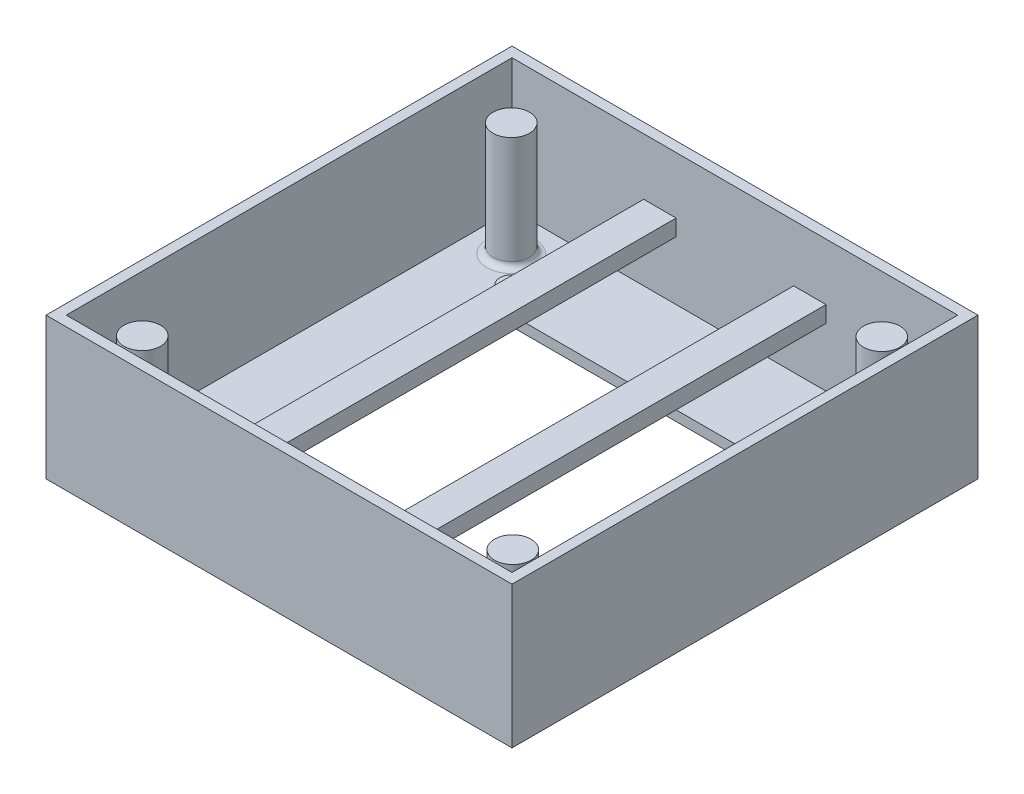
ISO-10303-21;
HEADER;
FILE_DESCRIPTION(('STEP AP214'),'2;1');
FILE_NAME('part.step','',(''),(''),'','','');
FILE_SCHEMA(('AUTOMOTIVE_DESIGN { 1 0 10303 214 1 1 1 1 }'));
ENDSEC;
DATA;
#1=APPLICATION_CONTEXT('core data for automotive mechanical design processes');
#2=APPLICATION_PROTOCOL_DEFINITION('international standard','automotive_design',2000,#1);
#3=PRODUCT_CONTEXT('',#1,'mechanical');
#4=PRODUCT('Part','Part','',(#3));
#5=PRODUCT_RELATED_PRODUCT_CATEGORY('part','',(#4));
#6=PRODUCT_DEFINITION_FORMATION('','',#4);
#7=PRODUCT_DEFINITION_CONTEXT('part definition',#1,'design');
#8=PRODUCT_DEFINITION('design','',#6,#7);
#9=PRODUCT_DEFINITION_SHAPE('','',#8);
#10=(LENGTH_UNIT() NAMED_UNIT(*) SI_UNIT(.MILLI.,.METRE.));
#11=(NAMED_UNIT(*) PLANE_ANGLE_UNIT() SI_UNIT($,.RADIAN.));
#12=(NAMED_UNIT(*) SI_UNIT($,.STERADIAN.) SOLID_ANGLE_UNIT());
#13=UNCERTAINTY_MEASURE_WITH_UNIT(LENGTH_MEASURE(1.E-05),#10,'distance_accuracy_value','');
#14=(GEOMETRIC_REPRESENTATION_CONTEXT(3) GLOBAL_UNCERTAINTY_ASSIGNED_CONTEXT((#13)) GLOBAL_UNIT_ASSIGNED_CONTEXT((#10,
#11,#12)) REPRESENTATION_CONTEXT('',''));
#15=CARTESIAN_POINT('',(0.,0.,0.));
#16=DIRECTION('',(0.,0.,1.));
#17=DIRECTION('',(1.,0.,0.));
#18=AXIS2_PLACEMENT_3D('',#15,#16,#17);
#19=CARTESIAN_POINT('',(-57.4999999999998,35.,-55.0000000000001));
#20=DIRECTION('',(0.,0.,1.));
#21=DIRECTION('',(1.,0.,0.));
#22=AXIS2_PLACEMENT_3D('',#19,#20,#21);
#23=PLANE('',#22);
#24=DIRECTION('',(-1.,0.,0.));
#25=VECTOR('',#24,1.);
#26=CARTESIAN_POINT('',(-57.4999999999998,21.,-55.0000000000001));
#27=LINE('',#26,#25);
#28=CARTESIAN_POINT('',(22.5,21.,-55.0000000000001));
#29=VERTEX_POINT('',#28);
#30=CARTESIAN_POINT('',(14.5,21.,-55.0000000000001));
#31=VERTEX_POINT('',#30);
#32=EDGE_CURVE('E192',#29,#31,#27,.T.);
#33=ORIENTED_EDGE('',*,*,#32,.F.);
#34=DIRECTION('',(0.,-1.,0.));
#35=VECTOR('',#34,1.);
#36=CARTESIAN_POINT('',(22.5,35.,-55.0000000000001));
#37=LINE('',#36,#35);
#38=CARTESIAN_POINT('',(22.5,17.,-55.0000000000001));
#39=VERTEX_POINT('',#38);
#40=EDGE_CURVE('E198',#29,#39,#37,.T.);
#41=ORIENTED_EDGE('',*,*,#40,.T.);
#42=DIRECTION('',(-1.,0.,0.));
#43=VECTOR('',#42,1.);
#44=CARTESIAN_POINT('',(-57.4999999999998,17.,-55.0000000000001));
#45=LINE('',#44,#43);
#46=CARTESIAN_POINT('',(14.5,17.,-55.0000000000001));
#47=VERTEX_POINT('',#46);
#48=EDGE_CURVE('E180',#39,#47,#45,.T.);
#49=ORIENTED_EDGE('',*,*,#48,.T.);
#50=DIRECTION('',(0.,1.,0.));
#51=VECTOR('',#50,1.);
#52=CARTESIAN_POINT('',(14.5,35.,-55.0000000000001));
#53=LINE('',#52,#51);
#54=EDGE_CURVE('E210',#47,#31,#53,.T.);
#55=ORIENTED_EDGE('',*,*,#54,.T.);
#56=EDGE_LOOP('',(#33,#41,#49,#55));
#57=FACE_BOUND('',#56,.T.);
#58=DIRECTION('',(-1.,0.,0.));
#59=VECTOR('',#58,1.);
#60=CARTESIAN_POINT('',(-57.4999999999998,2.5,-55.0000000000001));
#61=LINE('',#60,#59);
#62=CARTESIAN_POINT('',(55.0000000000002,2.5,-55.0000000000001));
#63=VERTEX_POINT('',#62);
#64=CARTESIAN_POINT('',(-54.9999999999998,2.5,-55.0000000000001));
#65=VERTEX_POINT('',#64);
#66=EDGE_CURVE('E274',#63,#65,#61,.T.);
#67=ORIENTED_EDGE('',*,*,#66,.F.);
#68=DIRECTION('',(0.,-1.,0.));
#69=VECTOR('',#68,1.);
#70=CARTESIAN_POINT('',(55.0000000000002,35.,-55.0000000000001));
#71=LINE('',#70,#69);
#72=CARTESIAN_POINT('',(55.0000000000002,35.,-55.0000000000001));
#73=VERTEX_POINT('',#72);
#74=EDGE_CURVE('E275',#73,#63,#71,.T.);
#75=ORIENTED_EDGE('',*,*,#74,.F.);
#76=DIRECTION('',(-1.,0.,0.));
#77=VECTOR('',#76,1.);
#78=CARTESIAN_POINT('',(-57.4999999999998,35.,-55.0000000000001));
#79=LINE('',#78,#77);
#80=CARTESIAN_POINT('',(-54.9999999999998,35.,-55.0000000000001));
#81=VERTEX_POINT('',#80);
#82=EDGE_CURVE('E304',#73,#81,#79,.T.);
#83=ORIENTED_EDGE('',*,*,#82,.T.);
#84=DIRECTION('',(0.,-1.,0.));
#85=VECTOR('',#84,1.);
#86=CARTESIAN_POINT('',(-54.9999999999998,35.,-55.0000000000001));
#87=LINE('',#86,#85);
#88=EDGE_CURVE('E280',#81,#65,#87,.T.);
#89=ORIENTED_EDGE('',*,*,#88,.T.);
#90=EDGE_LOOP('',(#67,#75,#83,#89));
#91=FACE_BOUND('',#90,.T.);
#92=DIRECTION('',(0.,1.,0.));
#93=VECTOR('',#92,1.);
#94=CARTESIAN_POINT('',(-22.5,35.,-55.0000000000001));
#95=LINE('',#94,#93);
#96=CARTESIAN_POINT('',(-22.5,17.,-55.0000000000001));
#97=VERTEX_POINT('',#96);
#98=CARTESIAN_POINT('',(-22.5,21.,-55.0000000000001));
#99=VERTEX_POINT('',#98);
#100=EDGE_CURVE('E61',#97,#99,#95,.T.);
#101=ORIENTED_EDGE('',*,*,#100,.T.);
#102=DIRECTION('',(1.,0.,0.));
#103=VECTOR('',#102,1.);
#104=CARTESIAN_POINT('',(-57.4999999999998,21.,-55.0000000000001));
#105=LINE('',#104,#103);
#106=CARTESIAN_POINT('',(-14.5,21.,-55.0000000000001));
#107=VERTEX_POINT('',#106);
#108=EDGE_CURVE('E65',#99,#107,#105,.T.);
#109=ORIENTED_EDGE('',*,*,#108,.T.);
#110=DIRECTION('',(0.,-1.,0.));
#111=VECTOR('',#110,1.);
#112=CARTESIAN_POINT('',(-14.5,35.,-55.0000000000001));
#113=LINE('',#112,#111);
#114=CARTESIAN_POINT('',(-14.5,17.,-55.0000000000001));
#115=VERTEX_POINT('',#114);
#116=EDGE_CURVE('E221',#107,#115,#113,.T.);
#117=ORIENTED_EDGE('',*,*,#116,.T.);
#118=DIRECTION('',(1.,0.,0.));
#119=VECTOR('',#118,1.);
#120=CARTESIAN_POINT('',(-57.4999999999998,17.,-55.0000000000001));
#121=LINE('',#120,#119);
#122=EDGE_CURVE('E209',#97,#115,#121,.T.);
#123=ORIENTED_EDGE('',*,*,#122,.F.);
#124=EDGE_LOOP('',(#101,#109,#117,#123));
#125=FACE_BOUND('',#124,.T.);
#126=ADVANCED_FACE('F45',(#57,#91,#125),#23,.T.);
#127=CARTESIAN_POINT('',(-57.4999999999998,35.,54.9999999999997));
#128=DIRECTION('',(0.,0.,-1.));
#129=DIRECTION('',(-1.,0.,0.));
#130=AXIS2_PLACEMENT_3D('',#127,#128,#129);
#131=PLANE('',#130);
#132=DIRECTION('',(1.,0.,0.));
#133=VECTOR('',#132,1.);
#134=CARTESIAN_POINT('',(-57.4999999999998,21.,54.9999999999997));
#135=LINE('',#134,#133);
#136=CARTESIAN_POINT('',(14.5,21.,54.9999999999997));
#137=VERTEX_POINT('',#136);
#138=CARTESIAN_POINT('',(22.5,21.,54.9999999999997));
#139=VERTEX_POINT('',#138);
#140=EDGE_CURVE('E408',#137,#139,#135,.T.);
#141=ORIENTED_EDGE('',*,*,#140,.F.);
#142=DIRECTION('',(0.,-1.,0.));
#143=VECTOR('',#142,1.);
#144=CARTESIAN_POINT('',(14.5,35.,54.9999999999997));
#145=LINE('',#144,#143);
#146=CARTESIAN_POINT('',(14.5,17.,54.9999999999997));
#147=VERTEX_POINT('',#146);
#148=EDGE_CURVE('E402',#137,#147,#145,.T.);
#149=ORIENTED_EDGE('',*,*,#148,.T.);
#150=DIRECTION('',(1.,0.,0.));
#151=VECTOR('',#150,1.);
#152=CARTESIAN_POINT('',(-57.4999999999998,17.,54.9999999999997));
#153=LINE('',#152,#151);
#154=CARTESIAN_POINT('',(22.5,17.,54.9999999999997));
#155=VERTEX_POINT('',#154);
#156=EDGE_CURVE('E399',#147,#155,#153,.T.);
#157=ORIENTED_EDGE('',*,*,#156,.T.);
#158=DIRECTION('',(0.,1.,0.));
#159=VECTOR('',#158,1.);
#160=CARTESIAN_POINT('',(22.5,35.,54.9999999999997));
#161=LINE('',#160,#159);
#162=EDGE_CURVE('E201',#155,#139,#161,.T.);
#163=ORIENTED_EDGE('',*,*,#162,.T.);
#164=EDGE_LOOP('',(#141,#149,#157,#163));
#165=FACE_BOUND('',#164,.T.);
#166=DIRECTION('',(1.,0.,0.));
#167=VECTOR('',#166,1.);
#168=CARTESIAN_POINT('',(-57.4999999999998,2.5,54.9999999999997));
#169=LINE('',#168,#167);
#170=CARTESIAN_POINT('',(-54.9999999999998,2.5,54.9999999999997));
#171=VERTEX_POINT('',#170);
#172=CARTESIAN_POINT('',(55.0000000000002,2.5,54.9999999999997));
#173=VERTEX_POINT('',#172);
#174=EDGE_CURVE('E295',#171,#173,#169,.T.);
#175=ORIENTED_EDGE('',*,*,#174,.F.);
#176=DIRECTION('',(0.,-1.,0.));
#177=VECTOR('',#176,1.);
#178=CARTESIAN_POINT('',(-54.9999999999998,35.,54.9999999999997));
#179=LINE('',#178,#177);
#180=CARTESIAN_POINT('',(-54.9999999999998,35.,54.9999999999997));
#181=VERTEX_POINT('',#180);
#182=EDGE_CURVE('E285',#181,#171,#179,.T.);
#183=ORIENTED_EDGE('',*,*,#182,.F.);
#184=DIRECTION('',(1.,0.,0.));
#185=VECTOR('',#184,1.);
#186=CARTESIAN_POINT('',(-57.4999999999998,35.,54.9999999999997));
#187=LINE('',#186,#185);
#188=CARTESIAN_POINT('',(55.0000000000002,35.,54.9999999999997));
#189=VERTEX_POINT('',#188);
#190=EDGE_CURVE('E286',#181,#189,#187,.T.);
#191=ORIENTED_EDGE('',*,*,#190,.T.);
#192=DIRECTION('',(0.,-1.,0.));
#193=VECTOR('',#192,1.);
#194=CARTESIAN_POINT('',(55.0000000000002,35.,54.9999999999997));
#195=LINE('',#194,#193);
#196=EDGE_CURVE('E281',#189,#173,#195,.T.);
#197=ORIENTED_EDGE('',*,*,#196,.T.);
#198=EDGE_LOOP('',(#175,#183,#191,#197));
#199=FACE_BOUND('',#198,.T.);
#200=DIRECTION('',(0.,1.,0.));
#201=VECTOR('',#200,1.);
#202=CARTESIAN_POINT('',(-14.5,35.,54.9999999999997));
#203=LINE('',#202,#201);
#204=CARTESIAN_POINT('',(-14.5,17.,54.9999999999997));
#205=VERTEX_POINT('',#204);
#206=CARTESIAN_POINT('',(-14.5,21.,54.9999999999997));
#207=VERTEX_POINT('',#206);
#208=EDGE_CURVE('E415',#205,#207,#203,.T.);
#209=ORIENTED_EDGE('',*,*,#208,.T.);
#210=DIRECTION('',(-1.,0.,0.));
#211=VECTOR('',#210,1.);
#212=CARTESIAN_POINT('',(-57.4999999999998,21.,54.9999999999997));
#213=LINE('',#212,#211);
#214=CARTESIAN_POINT('',(-22.5,21.,54.9999999999997));
#215=VERTEX_POINT('',#214);
#216=EDGE_CURVE('E421',#207,#215,#213,.T.);
#217=ORIENTED_EDGE('',*,*,#216,.T.);
#218=DIRECTION('',(0.,-1.,0.));
#219=VECTOR('',#218,1.);
#220=CARTESIAN_POINT('',(-22.5,35.,54.9999999999997));
#221=LINE('',#220,#219);
#222=CARTESIAN_POINT('',(-22.5,17.,54.9999999999997));
#223=VERTEX_POINT('',#222);
#224=EDGE_CURVE('E418',#215,#223,#221,.T.);
#225=ORIENTED_EDGE('',*,*,#224,.T.);
#226=DIRECTION('',(-1.,0.,0.));
#227=VECTOR('',#226,1.);
#228=CARTESIAN_POINT('',(-57.4999999999998,17.,54.9999999999997));
#229=LINE('',#228,#227);
#230=EDGE_CURVE('E411',#205,#223,#229,.T.);
#231=ORIENTED_EDGE('',*,*,#230,.F.);
#232=EDGE_LOOP('',(#209,#217,#225,#231));
#233=FACE_BOUND('',#232,.T.);
#234=ADVANCED_FACE('F478',(#165,#199,#233),#131,.T.);
#235=CARTESIAN_POINT('',(57.5000000000002,35.,-57.5000000000001));
#236=DIRECTION('',(-1.,0.,0.));
#237=DIRECTION('',(0.,0.,1.));
#238=AXIS2_PLACEMENT_3D('',#235,#236,#237);
#239=PLANE('',#238);
#240=DIRECTION('',(0.,0.,-1.));
#241=VECTOR('',#240,1.);
#242=CARTESIAN_POINT('',(57.5000000000002,0.,-57.5000000000001));
#243=LINE('',#242,#241);
#244=CARTESIAN_POINT('',(57.5000000000002,0.,57.4999999999997));
#245=VERTEX_POINT('',#244);
#246=CARTESIAN_POINT('',(57.5000000000002,0.,-57.5000000000001));
#247=VERTEX_POINT('',#246);
#248=EDGE_CURVE('E279',#245,#247,#243,.T.);
#249=ORIENTED_EDGE('',*,*,#248,.T.);
#250=DIRECTION('',(0.,-1.,0.));
#251=VECTOR('',#250,1.);
#252=CARTESIAN_POINT('',(57.5000000000002,35.,-57.5000000000001));
#253=LINE('',#252,#251);
#254=CARTESIAN_POINT('',(57.5000000000002,35.,-57.5000000000001));
#255=VERTEX_POINT('',#254);
#256=EDGE_CURVE('E350',#255,#247,#253,.T.);
#257=ORIENTED_EDGE('',*,*,#256,.F.);
#258=DIRECTION('',(0.,0.,-1.));
#259=VECTOR('',#258,1.);
#260=CARTESIAN_POINT('',(57.5000000000002,35.,-57.5000000000001));
#261=LINE('',#260,#259);
#262=CARTESIAN_POINT('',(57.5000000000002,35.,57.4999999999997));
#263=VERTEX_POINT('',#262);
#264=EDGE_CURVE('E313',#263,#255,#261,.T.);
#265=ORIENTED_EDGE('',*,*,#264,.F.);
#266=DIRECTION('',(0.,-1.,0.));
#267=VECTOR('',#266,1.);
#268=CARTESIAN_POINT('',(57.5000000000002,35.,57.4999999999997));
#269=LINE('',#268,#267);
#270=EDGE_CURVE('E327',#263,#245,#269,.T.);
#271=ORIENTED_EDGE('',*,*,#270,.T.);
#272=EDGE_LOOP('',(#249,#257,#265,#271));
#273=FACE_BOUND('',#272,.T.);
#274=ADVANCED_FACE('F481',(#273),#239,.F.);
#275=CARTESIAN_POINT('',(-57.4999999999998,35.,-57.5000000000001));
#276=DIRECTION('',(0.,0.,1.));
#277=DIRECTION('',(1.,0.,0.));
#278=AXIS2_PLACEMENT_3D('',#275,#276,#277);
#279=PLANE('',#278);
#280=DIRECTION('',(-1.,0.,0.));
#281=VECTOR('',#280,1.);
#282=CARTESIAN_POINT('',(-57.4999999999998,0.,-57.5000000000001));
#283=LINE('',#282,#281);
#284=CARTESIAN_POINT('',(-57.4999999999998,0.,-57.5000000000001));
#285=VERTEX_POINT('',#284);
#286=EDGE_CURVE('E331',#247,#285,#283,.T.);
#287=ORIENTED_EDGE('',*,*,#286,.T.);
#288=DIRECTION('',(0.,-1.,0.));
#289=VECTOR('',#288,1.);
#290=CARTESIAN_POINT('',(-57.4999999999998,35.,-57.5000000000001));
#291=LINE('',#290,#289);
#292=CARTESIAN_POINT('',(-57.4999999999998,35.,-57.5000000000001));
#293=VERTEX_POINT('',#292);
#294=EDGE_CURVE('E346',#293,#285,#291,.T.);
#295=ORIENTED_EDGE('',*,*,#294,.F.);
#296=DIRECTION('',(-1.,0.,0.));
#297=VECTOR('',#296,1.);
#298=CARTESIAN_POINT('',(-57.4999999999998,35.,-57.5000000000001));
#299=LINE('',#298,#297);
#300=EDGE_CURVE('E317',#255,#293,#299,.T.);
#301=ORIENTED_EDGE('',*,*,#300,.F.);
#302=ORIENTED_EDGE('',*,*,#256,.T.);
#303=EDGE_LOOP('',(#287,#295,#301,#302));
#304=FACE_BOUND('',#303,.T.);
#305=ADVANCED_FACE('F559',(#304),#279,.F.);
#306=CARTESIAN_POINT('',(-57.4999999999998,35.,-57.5000000000001));
#307=DIRECTION('',(1.,0.,0.));
#308=DIRECTION('',(0.,0.,-1.));
#309=AXIS2_PLACEMENT_3D('',#306,#307,#308);
#310=PLANE('',#309);
#311=DIRECTION('',(0.,0.,1.));
#312=VECTOR('',#311,1.);
#313=CARTESIAN_POINT('',(-57.4999999999998,0.,-57.5000000000001));
#314=LINE('',#313,#312);
#315=CARTESIAN_POINT('',(-57.4999999999998,0.,57.4999999999997));
#316=VERTEX_POINT('',#315);
#317=EDGE_CURVE('E334',#285,#316,#314,.T.);
#318=ORIENTED_EDGE('',*,*,#317,.T.);
#319=DIRECTION('',(0.,-1.,0.));
#320=VECTOR('',#319,1.);
#321=CARTESIAN_POINT('',(-57.4999999999998,35.,57.4999999999997));
#322=LINE('',#321,#320);
#323=CARTESIAN_POINT('',(-57.4999999999998,35.,57.4999999999997));
#324=VERTEX_POINT('',#323);
#325=EDGE_CURVE('E342',#324,#316,#322,.T.);
#326=ORIENTED_EDGE('',*,*,#325,.F.);
#327=DIRECTION('',(0.,0.,1.));
#328=VECTOR('',#327,1.);
#329=CARTESIAN_POINT('',(-57.4999999999998,35.,-57.5000000000001));
#330=LINE('',#329,#328);
#331=EDGE_CURVE('E321',#293,#324,#330,.T.);
#332=ORIENTED_EDGE('',*,*,#331,.F.);
#333=ORIENTED_EDGE('',*,*,#294,.T.);
#334=EDGE_LOOP('',(#318,#326,#332,#333));
#335=FACE_BOUND('',#334,.T.);
#336=ADVANCED_FACE('F555',(#335),#310,.F.);
#337=CARTESIAN_POINT('',(-57.4999999999998,35.,57.4999999999997));
#338=DIRECTION('',(0.,0.,-1.));
#339=DIRECTION('',(-1.,0.,0.));
#340=AXIS2_PLACEMENT_3D('',#337,#338,#339);
#341=PLANE('',#340);
#342=DIRECTION('',(1.,0.,0.));
#343=VECTOR('',#342,1.);
#344=CARTESIAN_POINT('',(-57.4999999999998,0.,57.4999999999997));
#345=LINE('',#344,#343);
#346=EDGE_CURVE('E318',#316,#245,#345,.T.);
#347=ORIENTED_EDGE('',*,*,#346,.T.);
#348=ORIENTED_EDGE('',*,*,#270,.F.);
#349=DIRECTION('',(1.,0.,0.));
#350=VECTOR('',#349,1.);
#351=CARTESIAN_POINT('',(-57.4999999999998,35.,57.4999999999997));
#352=LINE('',#351,#350);
#353=EDGE_CURVE('E324',#324,#263,#352,.T.);
#354=ORIENTED_EDGE('',*,*,#353,.F.);
#355=ORIENTED_EDGE('',*,*,#325,.T.);
#356=EDGE_LOOP('',(#347,#348,#354,#355));
#357=FACE_BOUND('',#356,.T.);
#358=ADVANCED_FACE('F549',(#357),#341,.F.);
#359=CARTESIAN_POINT('',(0.,35.,0.));
#360=DIRECTION('',(0.,1.,0.));
#361=DIRECTION('',(0.,0.,1.));
#362=AXIS2_PLACEMENT_3D('',#359,#360,#361);
#363=PLANE('',#362);
#364=DIRECTION('',(0.,0.,-1.));
#365=VECTOR('',#364,1.);
#366=CARTESIAN_POINT('',(55.0000000000002,35.,-57.5000000000001));
#367=LINE('',#366,#365);
#368=EDGE_CURVE('E301',#189,#73,#367,.T.);
#369=ORIENTED_EDGE('',*,*,#368,.F.);
#370=ORIENTED_EDGE('',*,*,#190,.F.);
#371=DIRECTION('',(0.,0.,1.));
#372=VECTOR('',#371,1.);
#373=CARTESIAN_POINT('',(-54.9999999999998,35.,-57.5000000000001));
#374=LINE('',#373,#372);
#375=EDGE_CURVE('E307',#81,#181,#374,.T.);
#376=ORIENTED_EDGE('',*,*,#375,.F.);
#377=ORIENTED_EDGE('',*,*,#82,.F.);
#378=EDGE_LOOP('',(#369,#370,#376,#377));
#379=FACE_BOUND('',#378,.T.);
#380=ORIENTED_EDGE('',*,*,#264,.T.);
#381=ORIENTED_EDGE('',*,*,#300,.T.);
#382=ORIENTED_EDGE('',*,*,#331,.T.);
#383=ORIENTED_EDGE('',*,*,#353,.T.);
#384=EDGE_LOOP('',(#380,#381,#382,#383));
#385=FACE_BOUND('',#384,.T.);
#386=ADVANCED_FACE('F472',(#379,#385),#363,.T.);
#387=CARTESIAN_POINT('',(0.,0.,0.));
#388=DIRECTION('',(0.,1.,0.));
#389=DIRECTION('',(0.,0.,1.));
#390=AXIS2_PLACEMENT_3D('',#387,#388,#389);
#391=PLANE('',#390);
#392=DIRECTION('',(1.,0.,0.));
#393=VECTOR('',#392,1.);
#394=CARTESIAN_POINT('',(32.5,0.,-32.5));
#395=LINE('',#394,#393);
#396=CARTESIAN_POINT('',(-32.5,0.,-32.5));
#397=VERTEX_POINT('',#396);
#398=CARTESIAN_POINT('',(32.5,0.,-32.5));
#399=VERTEX_POINT('',#398);
#400=EDGE_CURVE('E229',#397,#399,#395,.T.);
#401=ORIENTED_EDGE('',*,*,#400,.F.);
#402=DIRECTION('',(0.,0.,-1.));
#403=VECTOR('',#402,1.);
#404=CARTESIAN_POINT('',(-32.5,0.,-32.5));
#405=LINE('',#404,#403);
#406=CARTESIAN_POINT('',(-32.5,0.,32.5));
#407=VERTEX_POINT('',#406);
#408=EDGE_CURVE('E226',#407,#397,#405,.T.);
#409=ORIENTED_EDGE('',*,*,#408,.F.);
#410=DIRECTION('',(-1.,0.,0.));
#411=VECTOR('',#410,1.);
#412=CARTESIAN_POINT('',(32.5,0.,32.5));
#413=LINE('',#412,#411);
#414=CARTESIAN_POINT('',(32.5,0.,32.5));
#415=VERTEX_POINT('',#414);
#416=EDGE_CURVE('E237',#415,#407,#413,.T.);
#417=ORIENTED_EDGE('',*,*,#416,.F.);
#418=DIRECTION('',(0.,0.,1.));
#419=VECTOR('',#418,1.);
#420=CARTESIAN_POINT('',(32.5,0.,-32.5));
#421=LINE('',#420,#419);
#422=EDGE_CURVE('E233',#399,#415,#421,.T.);
#423=ORIENTED_EDGE('',*,*,#422,.F.);
#424=EDGE_LOOP('',(#401,#409,#417,#423));
#425=FACE_BOUND('',#424,.T.);
#426=ORIENTED_EDGE('',*,*,#248,.F.);
#427=ORIENTED_EDGE('',*,*,#346,.F.);
#428=ORIENTED_EDGE('',*,*,#317,.F.);
#429=ORIENTED_EDGE('',*,*,#286,.F.);
#430=EDGE_LOOP('',(#426,#427,#428,#429));
#431=FACE_BOUND('',#430,.T.);
#432=ADVANCED_FACE('F548',(#425,#431),#391,.F.);
#433=CARTESIAN_POINT('',(55.0000000000002,35.,-57.5000000000001));
#434=DIRECTION('',(-1.,0.,0.));
#435=DIRECTION('',(0.,0.,1.));
#436=AXIS2_PLACEMENT_3D('',#433,#434,#435);
#437=PLANE('',#436);
#438=DIRECTION('',(0.,0.,-1.));
#439=VECTOR('',#438,1.);
#440=CARTESIAN_POINT('',(55.0000000000002,2.5,-57.5000000000001));
#441=LINE('',#440,#439);
#442=EDGE_CURVE('E270',#173,#63,#441,.T.);
#443=ORIENTED_EDGE('',*,*,#442,.F.);
#444=ORIENTED_EDGE('',*,*,#196,.F.);
#445=ORIENTED_EDGE('',*,*,#368,.T.);
#446=ORIENTED_EDGE('',*,*,#74,.T.);
#447=EDGE_LOOP('',(#443,#444,#445,#446));
#448=FACE_BOUND('',#447,.T.);
#449=ADVANCED_FACE('F465',(#448),#437,.T.);
#450=CARTESIAN_POINT('',(-54.9999999999998,35.,-57.5000000000001));
#451=DIRECTION('',(1.,0.,0.));
#452=DIRECTION('',(0.,0.,-1.));
#453=AXIS2_PLACEMENT_3D('',#450,#451,#452);
#454=PLANE('',#453);
#455=DIRECTION('',(0.,0.,1.));
#456=VECTOR('',#455,1.);
#457=CARTESIAN_POINT('',(-54.9999999999998,2.5,-57.5000000000001));
#458=LINE('',#457,#456);
#459=EDGE_CURVE('E289',#65,#171,#458,.T.);
#460=ORIENTED_EDGE('',*,*,#459,.F.);
#461=ORIENTED_EDGE('',*,*,#88,.F.);
#462=ORIENTED_EDGE('',*,*,#375,.T.);
#463=ORIENTED_EDGE('',*,*,#182,.T.);
#464=EDGE_LOOP('',(#460,#461,#462,#463));
#465=FACE_BOUND('',#464,.T.);
#466=ADVANCED_FACE('F442',(#465),#454,.T.);
#467=CARTESIAN_POINT('',(0.,2.5,0.));
#468=DIRECTION('',(0.,1.,0.));
#469=DIRECTION('',(0.,0.,1.));
#470=AXIS2_PLACEMENT_3D('',#467,#468,#469);
#471=PLANE('',#470);
#472=CARTESIAN_POINT('',(37.5000000000002,2.5,37.4999999999997));
#473=DIRECTION('',(0.,1.,0.));
#474=DIRECTION('',(0.,0.,1.));
#475=AXIS2_PLACEMENT_3D('',#472,#473,#474);
#476=CIRCLE('',#475,3.);
#477=CARTESIAN_POINT('',(37.5000000000002,2.5,40.4999999999997));
#478=VERTEX_POINT('',#477);
#479=EDGE_CURVE('E11',#478,#478,#476,.T.);
#480=ORIENTED_EDGE('',*,*,#479,.F.);
#481=EDGE_LOOP('',(#480));
#482=FACE_BOUND('',#481,.T.);
#483=CARTESIAN_POINT('',(-37.4999999999998,2.5,37.4999999999997));
#484=DIRECTION('',(0.,1.,0.));
#485=DIRECTION('',(0.,0.,1.));
#486=AXIS2_PLACEMENT_3D('',#483,#484,#485);
#487=CIRCLE('',#486,3.);
#488=CARTESIAN_POINT('',(-37.4999999999998,2.5,40.4999999999997));
#489=VERTEX_POINT('',#488);
#490=EDGE_CURVE('E54',#489,#489,#487,.T.);
#491=ORIENTED_EDGE('',*,*,#490,.F.);
#492=EDGE_LOOP('',(#491));
#493=FACE_BOUND('',#492,.T.);
#494=CARTESIAN_POINT('',(-37.4999999999998,2.5,-37.5000000000001));
#495=DIRECTION('',(0.,1.,0.));
#496=DIRECTION('',(0.,0.,1.));
#497=AXIS2_PLACEMENT_3D('',#494,#495,#496);
#498=CIRCLE('',#497,3.);
#499=CARTESIAN_POINT('',(-37.4999999999998,2.5,-34.5000000000001));
#500=VERTEX_POINT('',#499);
#501=EDGE_CURVE('E428',#500,#500,#498,.T.);
#502=ORIENTED_EDGE('',*,*,#501,.F.);
#503=EDGE_LOOP('',(#502));
#504=FACE_BOUND('',#503,.T.);
#505=CARTESIAN_POINT('',(37.5000000000002,2.5,-37.5000000000001));
#506=DIRECTION('',(0.,1.,0.));
#507=DIRECTION('',(0.,0.,1.));
#508=AXIS2_PLACEMENT_3D('',#505,#506,#507);
#509=CIRCLE('',#508,3.);
#510=CARTESIAN_POINT('',(37.5000000000002,2.5,-34.5000000000001));
#511=VERTEX_POINT('',#510);
#512=EDGE_CURVE('E424',#511,#511,#509,.T.);
#513=ORIENTED_EDGE('',*,*,#512,.F.);
#514=EDGE_LOOP('',(#513));
#515=FACE_BOUND('',#514,.T.);
#516=DIRECTION('',(0.,0.,1.));
#517=VECTOR('',#516,1.);
#518=CARTESIAN_POINT('',(-32.5,2.5,0.));
#519=LINE('',#518,#517);
#520=CARTESIAN_POINT('',(-32.5,2.5,-32.5));
#521=VERTEX_POINT('',#520);
#522=CARTESIAN_POINT('',(-32.5,2.5,32.5));
#523=VERTEX_POINT('',#522);
#524=EDGE_CURVE('E396',#521,#523,#519,.T.);
#525=ORIENTED_EDGE('',*,*,#524,.F.);
#526=DIRECTION('',(-1.,0.,0.));
#527=VECTOR('',#526,1.);
#528=CARTESIAN_POINT('',(0.,2.5,-32.5));
#529=LINE('',#528,#527);
#530=CARTESIAN_POINT('',(32.5,2.5,-32.5));
#531=VERTEX_POINT('',#530);
#532=EDGE_CURVE('E386',#531,#521,#529,.T.);
#533=ORIENTED_EDGE('',*,*,#532,.F.);
#534=DIRECTION('',(0.,0.,-1.));
#535=VECTOR('',#534,1.);
#536=CARTESIAN_POINT('',(32.5,2.5,0.));
#537=LINE('',#536,#535);
#538=CARTESIAN_POINT('',(32.5,2.5,32.5));
#539=VERTEX_POINT('',#538);
#540=EDGE_CURVE('E389',#539,#531,#537,.T.);
#541=ORIENTED_EDGE('',*,*,#540,.F.);
#542=DIRECTION('',(1.,0.,0.));
#543=VECTOR('',#542,1.);
#544=CARTESIAN_POINT('',(0.,2.5,32.5));
#545=LINE('',#544,#543);
#546=EDGE_CURVE('E393',#523,#539,#545,.T.);
#547=ORIENTED_EDGE('',*,*,#546,.F.);
#548=EDGE_LOOP('',(#525,#533,#541,#547));
#549=FACE_BOUND('',#548,.T.);
#550=CARTESIAN_POINT('',(45.7200000000002,2.5,45.5299999999997));
#551=DIRECTION('',(0.,1.,0.));
#552=DIRECTION('',(0.,0.,1.));
#553=AXIS2_PLACEMENT_3D('',#550,#551,#552);
#554=CIRCLE('',#553,6.);
#555=CARTESIAN_POINT('',(45.7200000000002,2.5,51.5299999999997));
#556=VERTEX_POINT('',#555);
#557=EDGE_CURVE('E382',#556,#556,#554,.F.);
#558=ORIENTED_EDGE('',*,*,#557,.T.);
#559=EDGE_LOOP('',(#558));
#560=FACE_BOUND('',#559,.T.);
#561=CARTESIAN_POINT('',(45.7200000000002,2.5,-45.53));
#562=DIRECTION('',(0.,1.,0.));
#563=DIRECTION('',(0.,0.,1.));
#564=AXIS2_PLACEMENT_3D('',#561,#562,#563);
#565=CIRCLE('',#564,6.);
#566=CARTESIAN_POINT('',(45.7200000000002,2.5,-39.53));
#567=VERTEX_POINT('',#566);
#568=EDGE_CURVE('E374',#567,#567,#565,.F.);
#569=ORIENTED_EDGE('',*,*,#568,.T.);
#570=EDGE_LOOP('',(#569));
#571=FACE_BOUND('',#570,.T.);
#572=CARTESIAN_POINT('',(-45.7199999999998,2.5,-45.53));
#573=DIRECTION('',(0.,1.,0.));
#574=DIRECTION('',(0.,0.,1.));
#575=AXIS2_PLACEMENT_3D('',#572,#573,#574);
#576=CIRCLE('',#575,6.);
#577=CARTESIAN_POINT('',(-45.7199999999998,2.5,-39.53));
#578=VERTEX_POINT('',#577);
#579=EDGE_CURVE('E366',#578,#578,#576,.F.);
#580=ORIENTED_EDGE('',*,*,#579,.T.);
#581=EDGE_LOOP('',(#580));
#582=FACE_BOUND('',#581,.T.);
#583=CARTESIAN_POINT('',(-45.7199999999998,2.5,45.5299999999997));
#584=DIRECTION('',(0.,1.,0.));
#585=DIRECTION('',(0.,0.,1.));
#586=AXIS2_PLACEMENT_3D('',#583,#584,#585);
#587=CIRCLE('',#586,6.);
#588=CARTESIAN_POINT('',(-45.7199999999998,2.5,51.5299999999997));
#589=VERTEX_POINT('',#588);
#590=EDGE_CURVE('E358',#589,#589,#587,.F.);
#591=ORIENTED_EDGE('',*,*,#590,.T.);
#592=EDGE_LOOP('',(#591));
#593=FACE_BOUND('',#592,.T.);
#594=ORIENTED_EDGE('',*,*,#442,.T.);
#595=ORIENTED_EDGE('',*,*,#66,.T.);
#596=ORIENTED_EDGE('',*,*,#459,.T.);
#597=ORIENTED_EDGE('',*,*,#174,.T.);
#598=EDGE_LOOP('',(#594,#595,#596,#597));
#599=FACE_BOUND('',#598,.T.);
#600=ADVANCED_FACE('F438',(#482,#493,#504,#515,#549,#560,#571,#582,#593,#599),#471,.T.);
#601=CARTESIAN_POINT('',(-45.7199999999998,30.5,45.5299999999997));
#602=DIRECTION('',(0.,-1.,0.));
#603=DIRECTION('',(0.,0.,-1.));
#604=AXIS2_PLACEMENT_3D('',#601,#602,#603);
#605=CYLINDRICAL_SURFACE('',#604,4.5);
#606=CARTESIAN_POINT('',(-45.7199999999998,4.,45.5299999999997));
#607=DIRECTION('',(0.,1.,0.));
#608=DIRECTION('',(0.,0.,1.));
#609=AXIS2_PLACEMENT_3D('',#606,#607,#608);
#610=CIRCLE('',#609,4.5);
#611=CARTESIAN_POINT('',(-45.7199999999998,4.,50.0299999999997));
#612=VERTEX_POINT('',#611);
#613=EDGE_CURVE('E354',#612,#612,#610,.T.);
#614=ORIENTED_EDGE('',*,*,#613,.T.);
#615=EDGE_LOOP('',(#614));
#616=FACE_BOUND('',#615,.T.);
#617=CARTESIAN_POINT('',(-45.7199999999998,30.5,45.5299999999997));
#618=DIRECTION('',(0.,1.,0.));
#619=DIRECTION('',(0.,0.,1.));
#620=AXIS2_PLACEMENT_3D('',#617,#618,#619);
#621=CIRCLE('',#620,4.5);
#622=CARTESIAN_POINT('',(-45.7199999999998,30.5,50.0299999999997));
#623=VERTEX_POINT('',#622);
#624=EDGE_CURVE('E259',#623,#623,#621,.T.);
#625=ORIENTED_EDGE('',*,*,#624,.F.);
#626=EDGE_LOOP('',(#625));
#627=FACE_BOUND('',#626,.T.);
#628=ADVANCED_FACE('F441',(#616,#627),#605,.T.);
#629=CARTESIAN_POINT('',(-45.7199999999998,30.5,45.5299999999997));
#630=DIRECTION('',(0.,1.,0.));
#631=DIRECTION('',(0.,0.,1.));
#632=AXIS2_PLACEMENT_3D('',#629,#630,#631);
#633=PLANE('',#632);
#634=ORIENTED_EDGE('',*,*,#624,.T.);
#635=EDGE_LOOP('',(#634));
#636=FACE_BOUND('',#635,.T.);
#637=ADVANCED_FACE('F608',(#636),#633,.T.);
#638=CARTESIAN_POINT('',(-45.7199999999998,30.5,-45.53));
#639=DIRECTION('',(0.,-1.,0.));
#640=DIRECTION('',(0.,0.,-1.));
#641=AXIS2_PLACEMENT_3D('',#638,#639,#640);
#642=CYLINDRICAL_SURFACE('',#641,4.5);
#643=CARTESIAN_POINT('',(-45.7199999999998,4.,-45.53));
#644=DIRECTION('',(0.,1.,0.));
#645=DIRECTION('',(0.,0.,1.));
#646=AXIS2_PLACEMENT_3D('',#643,#644,#645);
#647=CIRCLE('',#646,4.5);
#648=CARTESIAN_POINT('',(-45.7199999999998,4.,-41.03));
#649=VERTEX_POINT('',#648);
#650=EDGE_CURVE('E362',#649,#649,#647,.T.);
#651=ORIENTED_EDGE('',*,*,#650,.T.);
#652=EDGE_LOOP('',(#651));
#653=FACE_BOUND('',#652,.T.);
#654=CARTESIAN_POINT('',(-45.7199999999998,30.5,-45.53));
#655=DIRECTION('',(0.,1.,0.));
#656=DIRECTION('',(0.,0.,1.));
#657=AXIS2_PLACEMENT_3D('',#654,#655,#656);
#658=CIRCLE('',#657,4.5);
#659=CARTESIAN_POINT('',(-45.7199999999998,30.5,-41.03));
#660=VERTEX_POINT('',#659);
#661=EDGE_CURVE('E255',#660,#660,#658,.T.);
#662=ORIENTED_EDGE('',*,*,#661,.F.);
#663=EDGE_LOOP('',(#662));
#664=FACE_BOUND('',#663,.T.);
#665=ADVANCED_FACE('F610',(#653,#664),#642,.T.);
#666=CARTESIAN_POINT('',(-45.7199999999998,30.5,-45.53));
#667=DIRECTION('',(0.,1.,0.));
#668=DIRECTION('',(0.,0.,1.));
#669=AXIS2_PLACEMENT_3D('',#666,#667,#668);
#670=PLANE('',#669);
#671=ORIENTED_EDGE('',*,*,#661,.T.);
#672=EDGE_LOOP('',(#671));
#673=FACE_BOUND('',#672,.T.);
#674=ADVANCED_FACE('F591',(#673),#670,.T.);
#675=CARTESIAN_POINT('',(45.7200000000002,30.5,-45.53));
#676=DIRECTION('',(0.,-1.,0.));
#677=DIRECTION('',(0.,0.,-1.));
#678=AXIS2_PLACEMENT_3D('',#675,#676,#677);
#679=CYLINDRICAL_SURFACE('',#678,4.5);
#680=CARTESIAN_POINT('',(45.7200000000002,4.,-45.53));
#681=DIRECTION('',(0.,1.,0.));
#682=DIRECTION('',(0.,0.,1.));
#683=AXIS2_PLACEMENT_3D('',#680,#681,#682);
#684=CIRCLE('',#683,4.5);
#685=CARTESIAN_POINT('',(45.7200000000002,4.,-41.03));
#686=VERTEX_POINT('',#685);
#687=EDGE_CURVE('E370',#686,#686,#684,.T.);
#688=ORIENTED_EDGE('',*,*,#687,.T.);
#689=EDGE_LOOP('',(#688));
#690=FACE_BOUND('',#689,.T.);
#691=CARTESIAN_POINT('',(45.7200000000002,30.5,-45.53));
#692=DIRECTION('',(0.,1.,0.));
#693=DIRECTION('',(0.,0.,1.));
#694=AXIS2_PLACEMENT_3D('',#691,#692,#693);
#695=CIRCLE('',#694,4.5);
#696=CARTESIAN_POINT('',(45.7200000000002,30.5,-41.03));
#697=VERTEX_POINT('',#696);
#698=EDGE_CURVE('E260',#697,#697,#695,.T.);
#699=ORIENTED_EDGE('',*,*,#698,.F.);
#700=EDGE_LOOP('',(#699));
#701=FACE_BOUND('',#700,.T.);
#702=ADVANCED_FACE('F588',(#690,#701),#679,.T.);
#703=CARTESIAN_POINT('',(45.7200000000002,30.5,-45.53));
#704=DIRECTION('',(0.,1.,0.));
#705=DIRECTION('',(0.,0.,1.));
#706=AXIS2_PLACEMENT_3D('',#703,#704,#705);
#707=PLANE('',#706);
#708=ORIENTED_EDGE('',*,*,#698,.T.);
#709=EDGE_LOOP('',(#708));
#710=FACE_BOUND('',#709,.T.);
#711=ADVANCED_FACE('F590',(#710),#707,.T.);
#712=CARTESIAN_POINT('',(45.7200000000002,30.5,45.5299999999997));
#713=DIRECTION('',(0.,-1.,0.));
#714=DIRECTION('',(0.,0.,-1.));
#715=AXIS2_PLACEMENT_3D('',#712,#713,#714);
#716=CYLINDRICAL_SURFACE('',#715,4.5);
#717=CARTESIAN_POINT('',(45.7200000000002,4.,45.5299999999997));
#718=DIRECTION('',(0.,1.,0.));
#719=DIRECTION('',(0.,0.,1.));
#720=AXIS2_PLACEMENT_3D('',#717,#718,#719);
#721=CIRCLE('',#720,4.5);
#722=CARTESIAN_POINT('',(45.7200000000002,4.,50.0299999999997));
#723=VERTEX_POINT('',#722);
#724=EDGE_CURVE('E378',#723,#723,#721,.T.);
#725=ORIENTED_EDGE('',*,*,#724,.T.);
#726=EDGE_LOOP('',(#725));
#727=FACE_BOUND('',#726,.T.);
#728=CARTESIAN_POINT('',(45.7200000000002,30.5,45.5299999999997));
#729=DIRECTION('',(0.,1.,0.));
#730=DIRECTION('',(0.,0.,1.));
#731=AXIS2_PLACEMENT_3D('',#728,#729,#730);
#732=CIRCLE('',#731,4.5);
#733=CARTESIAN_POINT('',(45.7200000000002,30.5,50.0299999999997));
#734=VERTEX_POINT('',#733);
#735=EDGE_CURVE('E245',#734,#734,#732,.T.);
#736=ORIENTED_EDGE('',*,*,#735,.F.);
#737=EDGE_LOOP('',(#736));
#738=FACE_BOUND('',#737,.T.);
#739=ADVANCED_FACE('F596',(#727,#738),#716,.T.);
#740=CARTESIAN_POINT('',(45.7200000000002,30.5,45.5299999999997));
#741=DIRECTION('',(0.,1.,0.));
#742=DIRECTION('',(0.,0.,1.));
#743=AXIS2_PLACEMENT_3D('',#740,#741,#742);
#744=PLANE('',#743);
#745=ORIENTED_EDGE('',*,*,#735,.T.);
#746=EDGE_LOOP('',(#745));
#747=FACE_BOUND('',#746,.T.);
#748=ADVANCED_FACE('F571',(#747),#744,.T.);
#749=CARTESIAN_POINT('',(-45.7199999999998,4.,45.5299999999997));
#750=DIRECTION('',(0.,1.,0.));
#751=DIRECTION('',(0.,0.,1.));
#752=AXIS2_PLACEMENT_3D('',#749,#750,#751);
#753=TOROIDAL_SURFACE('',#752,6.,1.5);
#754=ORIENTED_EDGE('',*,*,#590,.F.);
#755=EDGE_LOOP('',(#754));
#756=FACE_BOUND('',#755,.T.);
#757=ORIENTED_EDGE('',*,*,#613,.F.);
#758=EDGE_LOOP('',(#757));
#759=FACE_BOUND('',#758,.T.);
#760=ADVANCED_FACE('F567',(#756,#759),#753,.F.);
#761=CARTESIAN_POINT('',(-45.7199999999998,4.,-45.53));
#762=DIRECTION('',(0.,1.,0.));
#763=DIRECTION('',(0.,0.,1.));
#764=AXIS2_PLACEMENT_3D('',#761,#762,#763);
#765=TOROIDAL_SURFACE('',#764,6.,1.5);
#766=ORIENTED_EDGE('',*,*,#579,.F.);
#767=EDGE_LOOP('',(#766));
#768=FACE_BOUND('',#767,.T.);
#769=ORIENTED_EDGE('',*,*,#650,.F.);
#770=EDGE_LOOP('',(#769));
#771=FACE_BOUND('',#770,.T.);
#772=ADVANCED_FACE('F570',(#768,#771),#765,.F.);
#773=CARTESIAN_POINT('',(45.7200000000002,4.,-45.53));
#774=DIRECTION('',(0.,1.,0.));
#775=DIRECTION('',(0.,0.,1.));
#776=AXIS2_PLACEMENT_3D('',#773,#774,#775);
#777=TOROIDAL_SURFACE('',#776,6.,1.5);
#778=ORIENTED_EDGE('',*,*,#568,.F.);
#779=EDGE_LOOP('',(#778));
#780=FACE_BOUND('',#779,.T.);
#781=ORIENTED_EDGE('',*,*,#687,.F.);
#782=EDGE_LOOP('',(#781));
#783=FACE_BOUND('',#782,.T.);
#784=ADVANCED_FACE('F574',(#780,#783),#777,.F.);
#785=CARTESIAN_POINT('',(45.7200000000002,4.,45.5299999999997));
#786=DIRECTION('',(0.,1.,0.));
#787=DIRECTION('',(0.,0.,1.));
#788=AXIS2_PLACEMENT_3D('',#785,#786,#787);
#789=TOROIDAL_SURFACE('',#788,6.,1.5);
#790=ORIENTED_EDGE('',*,*,#557,.F.);
#791=EDGE_LOOP('',(#790));
#792=FACE_BOUND('',#791,.T.);
#793=ORIENTED_EDGE('',*,*,#724,.F.);
#794=EDGE_LOOP('',(#793));
#795=FACE_BOUND('',#794,.T.);
#796=ADVANCED_FACE('F47',(#792,#795),#789,.F.);
#797=CARTESIAN_POINT('',(-32.5,35.,-32.5));
#798=DIRECTION('',(-1.,0.,0.));
#799=DIRECTION('',(0.,0.,1.));
#800=AXIS2_PLACEMENT_3D('',#797,#798,#799);
#801=PLANE('',#800);
#802=ORIENTED_EDGE('',*,*,#524,.T.);
#803=DIRECTION('',(0.,-1.,0.));
#804=VECTOR('',#803,1.);
#805=CARTESIAN_POINT('',(-32.5,35.,32.5));
#806=LINE('',#805,#804);
#807=EDGE_CURVE('E242',#523,#407,#806,.T.);
#808=ORIENTED_EDGE('',*,*,#807,.T.);
#809=ORIENTED_EDGE('',*,*,#408,.T.);
#810=DIRECTION('',(0.,-1.,0.));
#811=VECTOR('',#810,1.);
#812=CARTESIAN_POINT('',(-32.5,35.,-32.5));
#813=LINE('',#812,#811);
#814=EDGE_CURVE('E241',#521,#397,#813,.T.);
#815=ORIENTED_EDGE('',*,*,#814,.F.);
#816=EDGE_LOOP('',(#802,#808,#809,#815));
#817=FACE_BOUND('',#816,.T.);
#818=ADVANCED_FACE('F583',(#817),#801,.F.);
#819=CARTESIAN_POINT('',(32.5,35.,32.5));
#820=DIRECTION('',(0.,0.,1.));
#821=DIRECTION('',(1.,0.,0.));
#822=AXIS2_PLACEMENT_3D('',#819,#820,#821);
#823=PLANE('',#822);
#824=ORIENTED_EDGE('',*,*,#546,.T.);
#825=DIRECTION('',(0.,-1.,0.));
#826=VECTOR('',#825,1.);
#827=CARTESIAN_POINT('',(32.5,35.,32.5));
#828=LINE('',#827,#826);
#829=EDGE_CURVE('E246',#539,#415,#828,.T.);
#830=ORIENTED_EDGE('',*,*,#829,.T.);
#831=ORIENTED_EDGE('',*,*,#416,.T.);
#832=ORIENTED_EDGE('',*,*,#807,.F.);
#833=EDGE_LOOP('',(#824,#830,#831,#832));
#834=FACE_BOUND('',#833,.T.);
#835=ADVANCED_FACE('F685',(#834),#823,.F.);
#836=CARTESIAN_POINT('',(32.5,35.,-32.5));
#837=DIRECTION('',(1.,0.,0.));
#838=DIRECTION('',(0.,0.,-1.));
#839=AXIS2_PLACEMENT_3D('',#836,#837,#838);
#840=PLANE('',#839);
#841=ORIENTED_EDGE('',*,*,#540,.T.);
#842=DIRECTION('',(0.,-1.,0.));
#843=VECTOR('',#842,1.);
#844=CARTESIAN_POINT('',(32.5,35.,-32.5));
#845=LINE('',#844,#843);
#846=EDGE_CURVE('E249',#531,#399,#845,.T.);
#847=ORIENTED_EDGE('',*,*,#846,.T.);
#848=ORIENTED_EDGE('',*,*,#422,.T.);
#849=ORIENTED_EDGE('',*,*,#829,.F.);
#850=EDGE_LOOP('',(#841,#847,#848,#849));
#851=FACE_BOUND('',#850,.T.);
#852=ADVANCED_FACE('F694',(#851),#840,.F.);
#853=CARTESIAN_POINT('',(32.5,35.,-32.5));
#854=DIRECTION('',(0.,0.,-1.));
#855=DIRECTION('',(-1.,0.,0.));
#856=AXIS2_PLACEMENT_3D('',#853,#854,#855);
#857=PLANE('',#856);
#858=ORIENTED_EDGE('',*,*,#532,.T.);
#859=ORIENTED_EDGE('',*,*,#814,.T.);
#860=ORIENTED_EDGE('',*,*,#400,.T.);
#861=ORIENTED_EDGE('',*,*,#846,.F.);
#862=EDGE_LOOP('',(#858,#859,#860,#861));
#863=FACE_BOUND('',#862,.T.);
#864=ADVANCED_FACE('F533',(#863),#857,.F.);
#865=CARTESIAN_POINT('',(22.5,21.,-55.9990000000004));
#866=DIRECTION('',(-1.,0.,0.));
#867=DIRECTION('',(0.,0.,1.));
#868=AXIS2_PLACEMENT_3D('',#865,#866,#867);
#869=PLANE('',#868);
#870=ORIENTED_EDGE('',*,*,#40,.F.);
#871=DIRECTION('',(0.,0.,-1.));
#872=VECTOR('',#871,1.);
#873=CARTESIAN_POINT('',(22.5,21.,-55.9990000000004));
#874=LINE('',#873,#872);
#875=EDGE_CURVE('E511',#139,#29,#874,.T.);
#876=ORIENTED_EDGE('',*,*,#875,.F.);
#877=ORIENTED_EDGE('',*,*,#162,.F.);
#878=DIRECTION('',(0.,0.,-1.));
#879=VECTOR('',#878,1.);
#880=CARTESIAN_POINT('',(22.5,17.,-55.9990000000004));
#881=LINE('',#880,#879);
#882=EDGE_CURVE('E183',#155,#39,#881,.T.);
#883=ORIENTED_EDGE('',*,*,#882,.T.);
#884=EDGE_LOOP('',(#870,#876,#877,#883));
#885=FACE_BOUND('',#884,.T.);
#886=ADVANCED_FACE('F196',(#885),#869,.F.);
#887=CARTESIAN_POINT('',(14.5,21.,-55.9990000000004));
#888=DIRECTION('',(1.,0.,0.));
#889=DIRECTION('',(0.,0.,-1.));
#890=AXIS2_PLACEMENT_3D('',#887,#888,#889);
#891=PLANE('',#890);
#892=ORIENTED_EDGE('',*,*,#54,.F.);
#893=DIRECTION('',(0.,0.,1.));
#894=VECTOR('',#893,1.);
#895=CARTESIAN_POINT('',(14.5,17.,-55.9990000000004));
#896=LINE('',#895,#894);
#897=EDGE_CURVE('E186',#47,#147,#896,.T.);
#898=ORIENTED_EDGE('',*,*,#897,.T.);
#899=ORIENTED_EDGE('',*,*,#148,.F.);
#900=DIRECTION('',(0.,0.,1.));
#901=VECTOR('',#900,1.);
#902=CARTESIAN_POINT('',(14.5,21.,-55.9990000000004));
#903=LINE('',#902,#901);
#904=EDGE_CURVE('E513',#31,#137,#903,.T.);
#905=ORIENTED_EDGE('',*,*,#904,.F.);
#906=EDGE_LOOP('',(#892,#898,#899,#905));
#907=FACE_BOUND('',#906,.T.);
#908=ADVANCED_FACE('F525',(#907),#891,.F.);
#909=CARTESIAN_POINT('',(0.,21.,0.));
#910=DIRECTION('',(0.,1.,0.));
#911=DIRECTION('',(0.,0.,1.));
#912=AXIS2_PLACEMENT_3D('',#909,#910,#911);
#913=PLANE('',#912);
#914=ORIENTED_EDGE('',*,*,#875,.T.);
#915=ORIENTED_EDGE('',*,*,#32,.T.);
#916=ORIENTED_EDGE('',*,*,#904,.T.);
#917=ORIENTED_EDGE('',*,*,#140,.T.);
#918=EDGE_LOOP('',(#914,#915,#916,#917));
#919=FACE_BOUND('',#918,.T.);
#920=ADVANCED_FACE('F522',(#919),#913,.T.);
#921=CARTESIAN_POINT('',(0.,17.,0.));
#922=DIRECTION('',(0.,1.,0.));
#923=DIRECTION('',(0.,0.,1.));
#924=AXIS2_PLACEMENT_3D('',#921,#922,#923);
#925=PLANE('',#924);
#926=CARTESIAN_POINT('',(18.5,17.,0.));
#927=DIRECTION('',(0.,-1.,0.));
#928=DIRECTION('',(0.,0.,-1.));
#929=AXIS2_PLACEMENT_3D('',#926,#927,#928);
#930=CIRCLE('',#929,0.85);
#931=CARTESIAN_POINT('',(18.5,17.,-0.85));
#932=VERTEX_POINT('',#931);
#933=EDGE_CURVE('E991',#932,#932,#930,.T.);
#934=ORIENTED_EDGE('',*,*,#933,.F.);
#935=EDGE_LOOP('',(#934));
#936=FACE_BOUND('',#935,.T.);
#937=ORIENTED_EDGE('',*,*,#48,.F.);
#938=ORIENTED_EDGE('',*,*,#882,.F.);
#939=ORIENTED_EDGE('',*,*,#156,.F.);
#940=ORIENTED_EDGE('',*,*,#897,.F.);
#941=EDGE_LOOP('',(#937,#938,#939,#940));
#942=FACE_BOUND('',#941,.T.);
#943=ADVANCED_FACE('F182',(#936,#942),#925,.F.);
#944=CARTESIAN_POINT('',(-22.5,21.,-56.0000000000001));
#945=DIRECTION('',(1.,0.,0.));
#946=DIRECTION('',(0.,0.,-1.));
#947=AXIS2_PLACEMENT_3D('',#944,#945,#946);
#948=PLANE('',#947);
#949=ORIENTED_EDGE('',*,*,#100,.F.);
#950=DIRECTION('',(0.,0.,1.));
#951=VECTOR('',#950,1.);
#952=CARTESIAN_POINT('',(-22.5,17.,-56.0000000000001));
#953=LINE('',#952,#951);
#954=EDGE_CURVE('E204',#97,#223,#953,.T.);
#955=ORIENTED_EDGE('',*,*,#954,.T.);
#956=ORIENTED_EDGE('',*,*,#224,.F.);
#957=DIRECTION('',(0.,0.,1.));
#958=VECTOR('',#957,1.);
#959=CARTESIAN_POINT('',(-22.5,21.,-56.0000000000001));
#960=LINE('',#959,#958);
#961=EDGE_CURVE('E496',#99,#215,#960,.T.);
#962=ORIENTED_EDGE('',*,*,#961,.F.);
#963=EDGE_LOOP('',(#949,#955,#956,#962));
#964=FACE_BOUND('',#963,.T.);
#965=ADVANCED_FACE('F742',(#964),#948,.F.);
#966=CARTESIAN_POINT('',(-14.5,21.,-56.0000000000001));
#967=DIRECTION('',(-1.,0.,0.));
#968=DIRECTION('',(0.,0.,1.));
#969=AXIS2_PLACEMENT_3D('',#966,#967,#968);
#970=PLANE('',#969);
#971=ORIENTED_EDGE('',*,*,#116,.F.);
#972=DIRECTION('',(0.,0.,-1.));
#973=VECTOR('',#972,1.);
#974=CARTESIAN_POINT('',(-14.5,21.,-56.0000000000001));
#975=LINE('',#974,#973);
#976=EDGE_CURVE('E193',#207,#107,#975,.T.);
#977=ORIENTED_EDGE('',*,*,#976,.F.);
#978=ORIENTED_EDGE('',*,*,#208,.F.);
#979=DIRECTION('',(0.,0.,-1.));
#980=VECTOR('',#979,1.);
#981=CARTESIAN_POINT('',(-14.5,17.,-56.0000000000001));
#982=LINE('',#981,#980);
#983=EDGE_CURVE('E501',#205,#115,#982,.T.);
#984=ORIENTED_EDGE('',*,*,#983,.T.);
#985=EDGE_LOOP('',(#971,#977,#978,#984));
#986=FACE_BOUND('',#985,.T.);
#987=ADVANCED_FACE('F497',(#986),#970,.F.);
#988=CARTESIAN_POINT('',(0.,21.,0.));
#989=DIRECTION('',(0.,-1.,0.));
#990=DIRECTION('',(0.,0.,-1.));
#991=AXIS2_PLACEMENT_3D('',#988,#989,#990);
#992=PLANE('',#991);
#993=ORIENTED_EDGE('',*,*,#108,.F.);
#994=ORIENTED_EDGE('',*,*,#961,.T.);
#995=ORIENTED_EDGE('',*,*,#216,.F.);
#996=ORIENTED_EDGE('',*,*,#976,.T.);
#997=EDGE_LOOP('',(#993,#994,#995,#996));
#998=FACE_BOUND('',#997,.T.);
#999=ADVANCED_FACE('F494',(#998),#992,.F.);
#1000=CARTESIAN_POINT('',(0.,17.,0.));
#1001=DIRECTION('',(0.,-1.,0.));
#1002=DIRECTION('',(0.,0.,-1.));
#1003=AXIS2_PLACEMENT_3D('',#1000,#1001,#1002);
#1004=PLANE('',#1003);
#1005=CARTESIAN_POINT('',(-18.5,17.,0.));
#1006=DIRECTION('',(0.,-1.,0.));
#1007=DIRECTION('',(0.,0.,-1.));
#1008=AXIS2_PLACEMENT_3D('',#1005,#1006,#1007);
#1009=CIRCLE('',#1008,0.85);
#1010=CARTESIAN_POINT('',(-18.5,17.,-0.85));
#1011=VERTEX_POINT('',#1010);
#1012=EDGE_CURVE('E987',#1011,#1011,#1009,.T.);
#1013=ORIENTED_EDGE('',*,*,#1012,.F.);
#1014=EDGE_LOOP('',(#1013));
#1015=FACE_BOUND('',#1014,.T.);
#1016=ORIENTED_EDGE('',*,*,#954,.F.);
#1017=ORIENTED_EDGE('',*,*,#122,.T.);
#1018=ORIENTED_EDGE('',*,*,#983,.F.);
#1019=ORIENTED_EDGE('',*,*,#230,.T.);
#1020=EDGE_LOOP('',(#1016,#1017,#1018,#1019));
#1021=FACE_BOUND('',#1020,.T.);
#1022=ADVANCED_FACE('F765',(#1015,#1021),#1004,.T.);
#1023=CARTESIAN_POINT('',(-18.5,20.,0.));
#1024=DIRECTION('',(0.,-1.,0.));
#1025=DIRECTION('',(0.,0.,-1.));
#1026=AXIS2_PLACEMENT_3D('',#1023,#1024,#1025);
#1027=CYLINDRICAL_SURFACE('',#1026,0.85);
#1028=CARTESIAN_POINT('',(-18.5,20.,0.));
#1029=DIRECTION('',(0.,-1.,0.));
#1030=DIRECTION('',(0.,0.,-1.));
#1031=AXIS2_PLACEMENT_3D('',#1028,#1029,#1030);
#1032=CIRCLE('',#1031,0.85);
#1033=CARTESIAN_POINT('',(-18.5,20.,-0.85));
#1034=VERTEX_POINT('',#1033);
#1035=EDGE_CURVE('E517',#1034,#1034,#1032,.T.);
#1036=ORIENTED_EDGE('',*,*,#1035,.F.);
#1037=EDGE_LOOP('',(#1036));
#1038=FACE_BOUND('',#1037,.T.);
#1039=ORIENTED_EDGE('',*,*,#1012,.T.);
#1040=EDGE_LOOP('',(#1039));
#1041=FACE_BOUND('',#1040,.T.);
#1042=ADVANCED_FACE('F773',(#1038,#1041),#1027,.F.);
#1043=CARTESIAN_POINT('',(-18.5,20.,0.));
#1044=DIRECTION('',(0.,-1.,0.));
#1045=DIRECTION('',(0.,0.,-1.));
#1046=AXIS2_PLACEMENT_3D('',#1043,#1044,#1045);
#1047=PLANE('',#1046);
#1048=ORIENTED_EDGE('',*,*,#1035,.T.);
#1049=EDGE_LOOP('',(#1048));
#1050=FACE_BOUND('',#1049,.T.);
#1051=ADVANCED_FACE('F782',(#1050),#1047,.T.);
#1052=CARTESIAN_POINT('',(18.5,20.,0.));
#1053=DIRECTION('',(0.,-1.,0.));
#1054=DIRECTION('',(0.,0.,-1.));
#1055=AXIS2_PLACEMENT_3D('',#1052,#1053,#1054);
#1056=CYLINDRICAL_SURFACE('',#1055,0.85);
#1057=CARTESIAN_POINT('',(18.5,20.,0.));
#1058=DIRECTION('',(0.,-1.,0.));
#1059=DIRECTION('',(0.,0.,-1.));
#1060=AXIS2_PLACEMENT_3D('',#1057,#1058,#1059);
#1061=CIRCLE('',#1060,0.85);
#1062=CARTESIAN_POINT('',(18.5,20.,-0.85));
#1063=VERTEX_POINT('',#1062);
#1064=EDGE_CURVE('E983',#1063,#1063,#1061,.T.);
#1065=ORIENTED_EDGE('',*,*,#1064,.F.);
#1066=EDGE_LOOP('',(#1065));
#1067=FACE_BOUND('',#1066,.T.);
#1068=ORIENTED_EDGE('',*,*,#933,.T.);
#1069=EDGE_LOOP('',(#1068));
#1070=FACE_BOUND('',#1069,.T.);
#1071=ADVANCED_FACE('F791',(#1067,#1070),#1056,.F.);
#1072=CARTESIAN_POINT('',(18.5,20.,0.));
#1073=DIRECTION('',(0.,-1.,0.));
#1074=DIRECTION('',(0.,0.,-1.));
#1075=AXIS2_PLACEMENT_3D('',#1072,#1073,#1074);
#1076=PLANE('',#1075);
#1077=ORIENTED_EDGE('',*,*,#1064,.T.);
#1078=EDGE_LOOP('',(#1077));
#1079=FACE_BOUND('',#1078,.T.);
#1080=ADVANCED_FACE('F800',(#1079),#1076,.T.);
#1081=CARTESIAN_POINT('',(37.5000000000002,4.,-37.5000000000001));
#1082=DIRECTION('',(0.,-1.,0.));
#1083=DIRECTION('',(0.,0.,-1.));
#1084=AXIS2_PLACEMENT_3D('',#1081,#1082,#1083);
#1085=CYLINDRICAL_SURFACE('',#1084,3.);
#1086=ORIENTED_EDGE('',*,*,#512,.T.);
#1087=EDGE_LOOP('',(#1086));
#1088=FACE_BOUND('',#1087,.T.);
#1089=CARTESIAN_POINT('',(37.5000000000002,4.,-37.5000000000001));
#1090=DIRECTION('',(0.,-1.,0.));
#1091=DIRECTION('',(0.,0.,-1.));
#1092=AXIS2_PLACEMENT_3D('',#1089,#1090,#1091);
#1093=CIRCLE('',#1092,3.);
#1094=CARTESIAN_POINT('',(37.5000000000002,4.,-40.5000000000001));
#1095=VERTEX_POINT('',#1094);
#1096=EDGE_CURVE('E979',#1095,#1095,#1093,.T.);
#1097=ORIENTED_EDGE('',*,*,#1096,.T.);
#1098=EDGE_LOOP('',(#1097));
#1099=FACE_BOUND('',#1098,.T.);
#1100=ADVANCED_FACE('F809',(#1088,#1099),#1085,.T.);
#1101=CARTESIAN_POINT('',(37.5000000000002,4.,-37.5000000000001));
#1102=DIRECTION('',(0.,-1.,0.));
#1103=DIRECTION('',(0.,0.,-1.));
#1104=AXIS2_PLACEMENT_3D('',#1101,#1102,#1103);
#1105=PLANE('',#1104);
#1106=ORIENTED_EDGE('',*,*,#1096,.F.);
#1107=EDGE_LOOP('',(#1106));
#1108=FACE_BOUND('',#1107,.T.);
#1109=ADVANCED_FACE('F818',(#1108),#1105,.F.);
#1110=CARTESIAN_POINT('',(-37.4999999999998,4.,-37.5000000000001));
#1111=DIRECTION('',(0.,-1.,0.));
#1112=DIRECTION('',(0.,0.,-1.));
#1113=AXIS2_PLACEMENT_3D('',#1110,#1111,#1112);
#1114=CYLINDRICAL_SURFACE('',#1113,3.);
#1115=ORIENTED_EDGE('',*,*,#501,.T.);
#1116=EDGE_LOOP('',(#1115));
#1117=FACE_BOUND('',#1116,.T.);
#1118=CARTESIAN_POINT('',(-37.4999999999998,4.,-37.5000000000001));
#1119=DIRECTION('',(0.,-1.,0.));
#1120=DIRECTION('',(0.,0.,-1.));
#1121=AXIS2_PLACEMENT_3D('',#1118,#1119,#1120);
#1122=CIRCLE('',#1121,3.);
#1123=CARTESIAN_POINT('',(-37.4999999999998,4.,-40.5000000000001));
#1124=VERTEX_POINT('',#1123);
#1125=EDGE_CURVE('E975',#1124,#1124,#1122,.T.);
#1126=ORIENTED_EDGE('',*,*,#1125,.T.);
#1127=EDGE_LOOP('',(#1126));
#1128=FACE_BOUND('',#1127,.T.);
#1129=ADVANCED_FACE('F827',(#1117,#1128),#1114,.T.);
#1130=CARTESIAN_POINT('',(-37.4999999999998,4.,-37.5000000000001));
#1131=DIRECTION('',(0.,-1.,0.));
#1132=DIRECTION('',(0.,0.,-1.));
#1133=AXIS2_PLACEMENT_3D('',#1130,#1131,#1132);
#1134=PLANE('',#1133);
#1135=ORIENTED_EDGE('',*,*,#1125,.F.);
#1136=EDGE_LOOP('',(#1135));
#1137=FACE_BOUND('',#1136,.T.);
#1138=ADVANCED_FACE('F836',(#1137),#1134,.F.);
#1139=CARTESIAN_POINT('',(-37.4999999999998,4.,37.4999999999997));
#1140=DIRECTION('',(0.,-1.,0.));
#1141=DIRECTION('',(0.,0.,-1.));
#1142=AXIS2_PLACEMENT_3D('',#1139,#1140,#1141);
#1143=CYLINDRICAL_SURFACE('',#1142,3.);
#1144=ORIENTED_EDGE('',*,*,#490,.T.);
#1145=EDGE_LOOP('',(#1144));
#1146=FACE_BOUND('',#1145,.T.);
#1147=CARTESIAN_POINT('',(-37.4999999999998,4.,37.4999999999997));
#1148=DIRECTION('',(0.,-1.,0.));
#1149=DIRECTION('',(0.,0.,-1.));
#1150=AXIS2_PLACEMENT_3D('',#1147,#1148,#1149);
#1151=CIRCLE('',#1150,3.);
#1152=CARTESIAN_POINT('',(-37.4999999999998,4.,34.4999999999997));
#1153=VERTEX_POINT('',#1152);
#1154=EDGE_CURVE('E971',#1153,#1153,#1151,.T.);
#1155=ORIENTED_EDGE('',*,*,#1154,.T.);
#1156=EDGE_LOOP('',(#1155));
#1157=FACE_BOUND('',#1156,.T.);
#1158=ADVANCED_FACE('F435',(#1146,#1157),#1143,.T.);
#1159=CARTESIAN_POINT('',(-37.4999999999998,4.,37.4999999999997));
#1160=DIRECTION('',(0.,-1.,0.));
#1161=DIRECTION('',(0.,0.,-1.));
#1162=AXIS2_PLACEMENT_3D('',#1159,#1160,#1161);
#1163=PLANE('',#1162);
#1164=ORIENTED_EDGE('',*,*,#1154,.F.);
#1165=EDGE_LOOP('',(#1164));
#1166=FACE_BOUND('',#1165,.T.);
#1167=ADVANCED_FACE('F853',(#1166),#1163,.F.);
#1168=CARTESIAN_POINT('',(37.5000000000002,4.,37.4999999999997));
#1169=DIRECTION('',(0.,-1.,0.));
#1170=DIRECTION('',(0.,0.,-1.));
#1171=AXIS2_PLACEMENT_3D('',#1168,#1169,#1170);
#1172=CYLINDRICAL_SURFACE('',#1171,3.);
#1173=ORIENTED_EDGE('',*,*,#479,.T.);
#1174=EDGE_LOOP('',(#1173));
#1175=FACE_BOUND('',#1174,.T.);
#1176=CARTESIAN_POINT('',(37.5000000000002,4.,37.4999999999997));
#1177=DIRECTION('',(0.,-1.,0.));
#1178=DIRECTION('',(0.,0.,-1.));
#1179=AXIS2_PLACEMENT_3D('',#1176,#1177,#1178);
#1180=CIRCLE('',#1179,3.);
#1181=CARTESIAN_POINT('',(37.5000000000002,4.,34.4999999999997));
#1182=VERTEX_POINT('',#1181);
#1183=EDGE_CURVE('E968',#1182,#1182,#1180,.T.);
#1184=ORIENTED_EDGE('',*,*,#1183,.T.);
#1185=EDGE_LOOP('',(#1184));
#1186=FACE_BOUND('',#1185,.T.);
#1187=ADVANCED_FACE('F861',(#1175,#1186),#1172,.T.);
#1188=CARTESIAN_POINT('',(37.5000000000002,4.,37.4999999999997));
#1189=DIRECTION('',(0.,-1.,0.));
#1190=DIRECTION('',(0.,0.,-1.));
#1191=AXIS2_PLACEMENT_3D('',#1188,#1189,#1190);
#1192=PLANE('',#1191);
#1193=ORIENTED_EDGE('',*,*,#1183,.F.);
#1194=EDGE_LOOP('',(#1193));
#1195=FACE_BOUND('',#1194,.T.);
#1196=ADVANCED_FACE('F870',(#1195),#1192,.F.);
#1197=CLOSED_SHELL('',(#126,#234,#274,#305,#336,#358,#386,#432,#449,#466,#600,#628,#637,#665,
#674,#702,#711,#739,#748,#760,#772,#784,#796,#818,#835,#852,#864,#886,#908,#920,#943,#965,#987,
#999,#1022,#1042,#1051,#1071,#1080,#1100,#1109,#1129,#1138,#1158,#1167,#1187,#1196));
#1198=MANIFOLD_SOLID_BREP('B2',#1197);
#1199=ADVANCED_BREP_SHAPE_REPRESENTATION('',(#18,#1198),#14);
#1200=SHAPE_DEFINITION_REPRESENTATION(#9,#1199);
ENDSEC;
END-ISO-10303-21;
